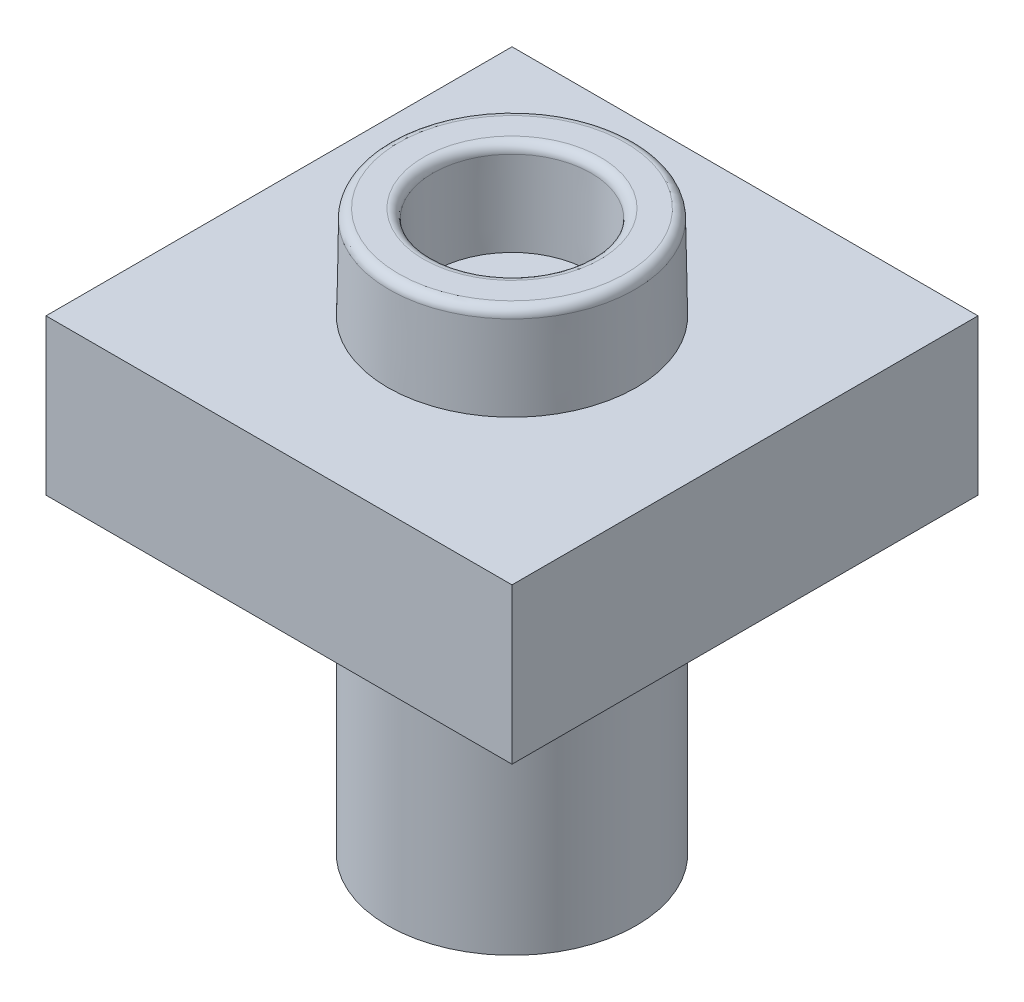
ISO-10303-21;
HEADER;
FILE_DESCRIPTION(('STEP AP214'),'2;1');
FILE_NAME('part.step','',(''),(''),'','','');
FILE_SCHEMA(('AUTOMOTIVE_DESIGN { 1 0 10303 214 1 1 1 1 }'));
ENDSEC;
DATA;
#1=APPLICATION_CONTEXT('core data for automotive mechanical design processes');
#2=APPLICATION_PROTOCOL_DEFINITION('international standard','automotive_design',2000,#1);
#3=PRODUCT_CONTEXT('',#1,'mechanical');
#4=PRODUCT('Part','Part','',(#3));
#5=PRODUCT_RELATED_PRODUCT_CATEGORY('part','',(#4));
#6=PRODUCT_DEFINITION_FORMATION('','',#4);
#7=PRODUCT_DEFINITION_CONTEXT('part definition',#1,'design');
#8=PRODUCT_DEFINITION('design','',#6,#7);
#9=PRODUCT_DEFINITION_SHAPE('','',#8);
#10=(LENGTH_UNIT() NAMED_UNIT(*) SI_UNIT(.MILLI.,.METRE.));
#11=(NAMED_UNIT(*) PLANE_ANGLE_UNIT() SI_UNIT($,.RADIAN.));
#12=(NAMED_UNIT(*) SI_UNIT($,.STERADIAN.) SOLID_ANGLE_UNIT());
#13=UNCERTAINTY_MEASURE_WITH_UNIT(LENGTH_MEASURE(1.E-05),#10,'distance_accuracy_value','');
#14=(GEOMETRIC_REPRESENTATION_CONTEXT(3) GLOBAL_UNCERTAINTY_ASSIGNED_CONTEXT((#13)) GLOBAL_UNIT_ASSIGNED_CONTEXT((#10,
#11,#12)) REPRESENTATION_CONTEXT('',''));
#15=CARTESIAN_POINT('',(0.,0.,0.));
#16=DIRECTION('',(0.,0.,1.));
#17=DIRECTION('',(1.,0.,0.));
#18=AXIS2_PLACEMENT_3D('',#15,#16,#17);
#19=CARTESIAN_POINT('',(-7.49999999999999,5.,7.5));
#20=DIRECTION('',(1.,0.,0.));
#21=DIRECTION('',(0.,0.,-1.));
#22=AXIS2_PLACEMENT_3D('',#19,#20,#21);
#23=PLANE('',#22);
#24=DIRECTION('',(0.,0.,1.));
#25=VECTOR('',#24,1.);
#26=CARTESIAN_POINT('',(-7.49999999999999,0.,7.5));
#27=LINE('',#26,#25);
#28=CARTESIAN_POINT('',(-7.49999999999999,0.,-7.5));
#29=VERTEX_POINT('',#28);
#30=CARTESIAN_POINT('',(-7.49999999999999,0.,7.5));
#31=VERTEX_POINT('',#30);
#32=EDGE_CURVE('E106',#29,#31,#27,.T.);
#33=ORIENTED_EDGE('',*,*,#32,.T.);
#34=DIRECTION('',(0.,-1.,0.));
#35=VECTOR('',#34,1.);
#36=CARTESIAN_POINT('',(-7.49999999999999,5.,7.5));
#37=LINE('',#36,#35);
#38=CARTESIAN_POINT('',(-7.49999999999999,5.,7.5));
#39=VERTEX_POINT('',#38);
#40=EDGE_CURVE('E97',#39,#31,#37,.T.);
#41=ORIENTED_EDGE('',*,*,#40,.F.);
#42=DIRECTION('',(0.,0.,1.));
#43=VECTOR('',#42,1.);
#44=CARTESIAN_POINT('',(-7.49999999999999,5.,7.5));
#45=LINE('',#44,#43);
#46=CARTESIAN_POINT('',(-7.49999999999999,5.,-7.5));
#47=VERTEX_POINT('',#46);
#48=EDGE_CURVE('E91',#47,#39,#45,.T.);
#49=ORIENTED_EDGE('',*,*,#48,.F.);
#50=DIRECTION('',(0.,-1.,0.));
#51=VECTOR('',#50,1.);
#52=CARTESIAN_POINT('',(-7.49999999999999,5.,-7.5));
#53=LINE('',#52,#51);
#54=EDGE_CURVE('E102',#47,#29,#53,.T.);
#55=ORIENTED_EDGE('',*,*,#54,.T.);
#56=EDGE_LOOP('',(#33,#41,#49,#55));
#57=FACE_BOUND('',#56,.T.);
#58=ADVANCED_FACE('F37',(#57),#23,.F.);
#59=CARTESIAN_POINT('',(7.50000000000001,5.,7.5));
#60=DIRECTION('',(0.,0.,-1.));
#61=DIRECTION('',(-1.,0.,0.));
#62=AXIS2_PLACEMENT_3D('',#59,#60,#61);
#63=PLANE('',#62);
#64=DIRECTION('',(1.,0.,0.));
#65=VECTOR('',#64,1.);
#66=CARTESIAN_POINT('',(7.50000000000001,0.,7.5));
#67=LINE('',#66,#65);
#68=CARTESIAN_POINT('',(7.50000000000001,0.,7.5));
#69=VERTEX_POINT('',#68);
#70=EDGE_CURVE('E96',#31,#69,#67,.T.);
#71=ORIENTED_EDGE('',*,*,#70,.T.);
#72=DIRECTION('',(0.,-1.,0.));
#73=VECTOR('',#72,1.);
#74=CARTESIAN_POINT('',(7.50000000000001,5.,7.5));
#75=LINE('',#74,#73);
#76=CARTESIAN_POINT('',(7.50000000000001,5.,7.5));
#77=VERTEX_POINT('',#76);
#78=EDGE_CURVE('E94',#77,#69,#75,.T.);
#79=ORIENTED_EDGE('',*,*,#78,.F.);
#80=DIRECTION('',(1.,0.,0.));
#81=VECTOR('',#80,1.);
#82=CARTESIAN_POINT('',(7.50000000000001,5.,7.5));
#83=LINE('',#82,#81);
#84=EDGE_CURVE('E86',#39,#77,#83,.T.);
#85=ORIENTED_EDGE('',*,*,#84,.F.);
#86=ORIENTED_EDGE('',*,*,#40,.T.);
#87=EDGE_LOOP('',(#71,#79,#85,#86));
#88=FACE_BOUND('',#87,.T.);
#89=ADVANCED_FACE('F95',(#88),#63,.F.);
#90=CARTESIAN_POINT('',(7.50000000000001,5.,7.5));
#91=DIRECTION('',(-1.,0.,0.));
#92=DIRECTION('',(0.,0.,1.));
#93=AXIS2_PLACEMENT_3D('',#90,#91,#92);
#94=PLANE('',#93);
#95=DIRECTION('',(0.,0.,-1.));
#96=VECTOR('',#95,1.);
#97=CARTESIAN_POINT('',(7.50000000000001,0.,7.5));
#98=LINE('',#97,#96);
#99=CARTESIAN_POINT('',(7.50000000000001,0.,-7.5));
#100=VERTEX_POINT('',#99);
#101=EDGE_CURVE('E72',#69,#100,#98,.T.);
#102=ORIENTED_EDGE('',*,*,#101,.T.);
#103=DIRECTION('',(0.,-1.,0.));
#104=VECTOR('',#103,1.);
#105=CARTESIAN_POINT('',(7.50000000000001,5.,-7.5));
#106=LINE('',#105,#104);
#107=CARTESIAN_POINT('',(7.50000000000001,5.,-7.5));
#108=VERTEX_POINT('',#107);
#109=EDGE_CURVE('E98',#108,#100,#106,.T.);
#110=ORIENTED_EDGE('',*,*,#109,.F.);
#111=DIRECTION('',(0.,0.,-1.));
#112=VECTOR('',#111,1.);
#113=CARTESIAN_POINT('',(7.50000000000001,5.,7.5));
#114=LINE('',#113,#112);
#115=EDGE_CURVE('E89',#77,#108,#114,.T.);
#116=ORIENTED_EDGE('',*,*,#115,.F.);
#117=ORIENTED_EDGE('',*,*,#78,.T.);
#118=EDGE_LOOP('',(#102,#110,#116,#117));
#119=FACE_BOUND('',#118,.T.);
#120=ADVANCED_FACE('F100',(#119),#94,.F.);
#121=CARTESIAN_POINT('',(7.50000000000001,5.,-7.5));
#122=DIRECTION('',(0.,0.,1.));
#123=DIRECTION('',(1.,0.,0.));
#124=AXIS2_PLACEMENT_3D('',#121,#122,#123);
#125=PLANE('',#124);
#126=DIRECTION('',(-1.,0.,0.));
#127=VECTOR('',#126,1.);
#128=CARTESIAN_POINT('',(7.50000000000001,0.,-7.5));
#129=LINE('',#128,#127);
#130=EDGE_CURVE('E78',#100,#29,#129,.T.);
#131=ORIENTED_EDGE('',*,*,#130,.T.);
#132=ORIENTED_EDGE('',*,*,#54,.F.);
#133=DIRECTION('',(-1.,0.,0.));
#134=VECTOR('',#133,1.);
#135=CARTESIAN_POINT('',(7.50000000000001,5.,-7.5));
#136=LINE('',#135,#134);
#137=EDGE_CURVE('E55',#108,#47,#136,.T.);
#138=ORIENTED_EDGE('',*,*,#137,.F.);
#139=ORIENTED_EDGE('',*,*,#109,.T.);
#140=EDGE_LOOP('',(#131,#132,#138,#139));
#141=FACE_BOUND('',#140,.T.);
#142=ADVANCED_FACE('F179',(#141),#125,.F.);
#143=CARTESIAN_POINT('',(0.,5.,0.));
#144=DIRECTION('',(0.,1.,0.));
#145=DIRECTION('',(0.,0.,1.));
#146=AXIS2_PLACEMENT_3D('',#143,#144,#145);
#147=PLANE('',#146);
#148=CARTESIAN_POINT('',(0.,5.,0.));
#149=DIRECTION('',(0.,1.,0.));
#150=DIRECTION('',(0.,0.,1.));
#151=AXIS2_PLACEMENT_3D('',#148,#149,#150);
#152=CIRCLE('',#151,4.);
#153=CARTESIAN_POINT('',(0.,5.,4.));
#154=VERTEX_POINT('',#153);
#155=EDGE_CURVE('E109',#154,#154,#152,.T.);
#156=ORIENTED_EDGE('',*,*,#155,.F.);
#157=EDGE_LOOP('',(#156));
#158=FACE_BOUND('',#157,.T.);
#159=ORIENTED_EDGE('',*,*,#48,.T.);
#160=ORIENTED_EDGE('',*,*,#84,.T.);
#161=ORIENTED_EDGE('',*,*,#115,.T.);
#162=ORIENTED_EDGE('',*,*,#137,.T.);
#163=EDGE_LOOP('',(#159,#160,#161,#162));
#164=FACE_BOUND('',#163,.T.);
#165=ADVANCED_FACE('F87',(#158,#164),#147,.T.);
#166=CARTESIAN_POINT('',(0.,0.,0.));
#167=DIRECTION('',(0.,1.,0.));
#168=DIRECTION('',(0.,0.,1.));
#169=AXIS2_PLACEMENT_3D('',#166,#167,#168);
#170=PLANE('',#169);
#171=CARTESIAN_POINT('',(0.,0.,0.));
#172=DIRECTION('',(0.,-1.,0.));
#173=DIRECTION('',(0.,0.,-1.));
#174=AXIS2_PLACEMENT_3D('',#171,#172,#173);
#175=CIRCLE('',#174,4.);
#176=CARTESIAN_POINT('',(0.,0.,-4.));
#177=VERTEX_POINT('',#176);
#178=EDGE_CURVE('E11',#177,#177,#175,.T.);
#179=ORIENTED_EDGE('',*,*,#178,.F.);
#180=EDGE_LOOP('',(#179));
#181=FACE_BOUND('',#180,.T.);
#182=ORIENTED_EDGE('',*,*,#32,.F.);
#183=ORIENTED_EDGE('',*,*,#130,.F.);
#184=ORIENTED_EDGE('',*,*,#101,.F.);
#185=ORIENTED_EDGE('',*,*,#70,.F.);
#186=EDGE_LOOP('',(#182,#183,#184,#185));
#187=FACE_BOUND('',#186,.T.);
#188=ADVANCED_FACE('F142',(#181,#187),#170,.F.);
#189=CARTESIAN_POINT('',(0.,8.,0.));
#190=DIRECTION('',(0.,1.,0.));
#191=DIRECTION('',(0.,0.,1.));
#192=AXIS2_PLACEMENT_3D('',#189,#190,#191);
#193=PLANE('',#192);
#194=CARTESIAN_POINT('',(0.,8.,0.));
#195=DIRECTION('',(0.,1.,0.));
#196=DIRECTION('',(0.,0.,1.));
#197=AXIS2_PLACEMENT_3D('',#194,#195,#196);
#198=CIRCLE('',#197,2.84717437371936);
#199=CARTESIAN_POINT('',(0.,8.,2.84717437371936));
#200=VERTEX_POINT('',#199);
#201=EDGE_CURVE('E124',#200,#200,#198,.F.);
#202=ORIENTED_EDGE('',*,*,#201,.T.);
#203=EDGE_LOOP('',(#202));
#204=FACE_BOUND('',#203,.T.);
#205=CARTESIAN_POINT('',(0.,8.,0.));
#206=DIRECTION('',(0.,1.,0.));
#207=DIRECTION('',(0.,0.,1.));
#208=AXIS2_PLACEMENT_3D('',#205,#206,#207);
#209=CIRCLE('',#208,3.65282562628064);
#210=CARTESIAN_POINT('',(0.,8.,3.65282562628064));
#211=VERTEX_POINT('',#210);
#212=EDGE_CURVE('E122',#211,#211,#209,.T.);
#213=ORIENTED_EDGE('',*,*,#212,.T.);
#214=EDGE_LOOP('',(#213));
#215=FACE_BOUND('',#214,.T.);
#216=ADVANCED_FACE('F140',(#204,#215),#193,.T.);
#217=CARTESIAN_POINT('',(0.,5.,0.));
#218=DIRECTION('',(0.,-1.,0.));
#219=DIRECTION('',(0.,0.,1.));
#220=AXIS2_PLACEMENT_3D('',#217,#218,#219);
#221=CONICAL_SURFACE('',#220,4.,0.0174532925199433);
#222=CARTESIAN_POINT('',(0.,7.70523572193119,0.));
#223=DIRECTION('',(0.,-1.,0.));
#224=DIRECTION('',(0.,0.,-1.));
#225=AXIS2_PLACEMENT_3D('',#222,#223,#224);
#226=CIRCLE('',#225,3.95277993482756);
#227=CARTESIAN_POINT('',(0.,7.70523572193119,-3.95277993482756));
#228=VERTEX_POINT('',#227);
#229=EDGE_CURVE('E41',#228,#228,#226,.T.);
#230=ORIENTED_EDGE('',*,*,#229,.T.);
#231=EDGE_LOOP('',(#230));
#232=FACE_BOUND('',#231,.T.);
#233=ORIENTED_EDGE('',*,*,#155,.T.);
#234=EDGE_LOOP('',(#233));
#235=FACE_BOUND('',#234,.T.);
#236=ADVANCED_FACE('F131',(#232,#235),#221,.T.);
#237=CARTESIAN_POINT('',(0.,5.,0.));
#238=DIRECTION('',(0.,1.,0.));
#239=DIRECTION('',(0.,0.,1.));
#240=AXIS2_PLACEMENT_3D('',#237,#238,#239);
#241=CONICAL_SURFACE('',#240,2.5,0.0174532925199433);
#242=CARTESIAN_POINT('',(0.,7.70523572193119,0.));
#243=DIRECTION('',(0.,-1.,0.));
#244=DIRECTION('',(0.,0.,-1.));
#245=AXIS2_PLACEMENT_3D('',#242,#243,#244);
#246=CIRCLE('',#245,2.54722006517244);
#247=CARTESIAN_POINT('',(0.,7.70523572193119,-2.54722006517244));
#248=VERTEX_POINT('',#247);
#249=EDGE_CURVE('E119',#248,#248,#246,.F.);
#250=ORIENTED_EDGE('',*,*,#249,.T.);
#251=EDGE_LOOP('',(#250));
#252=FACE_BOUND('',#251,.T.);
#253=CARTESIAN_POINT('',(0.,5.,0.));
#254=DIRECTION('',(0.,1.,0.));
#255=DIRECTION('',(0.,0.,1.));
#256=AXIS2_PLACEMENT_3D('',#253,#254,#255);
#257=CIRCLE('',#256,2.5);
#258=CARTESIAN_POINT('',(0.,5.,2.5));
#259=VERTEX_POINT('',#258);
#260=EDGE_CURVE('E116',#259,#259,#257,.F.);
#261=ORIENTED_EDGE('',*,*,#260,.T.);
#262=EDGE_LOOP('',(#261));
#263=FACE_BOUND('',#262,.T.);
#264=ADVANCED_FACE('F148',(#252,#263),#241,.F.);
#265=ORIENTED_EDGE('',*,*,#260,.F.);
#266=EDGE_LOOP('',(#265));
#267=FACE_BOUND('',#266,.T.);
#268=ADVANCED_FACE('F162',(#267),#147,.T.);
#269=CARTESIAN_POINT('',(0.,7.7,0.));
#270=DIRECTION('',(0.,1.,0.));
#271=DIRECTION('',(0.,0.,1.));
#272=AXIS2_PLACEMENT_3D('',#269,#270,#271);
#273=TOROIDAL_SURFACE('',#272,2.84717437371936,0.3);
#274=ORIENTED_EDGE('',*,*,#201,.F.);
#275=EDGE_LOOP('',(#274));
#276=FACE_BOUND('',#275,.T.);
#277=ORIENTED_EDGE('',*,*,#249,.F.);
#278=EDGE_LOOP('',(#277));
#279=FACE_BOUND('',#278,.T.);
#280=ADVANCED_FACE('F137',(#276,#279),#273,.T.);
#281=CARTESIAN_POINT('',(0.,7.7,0.));
#282=DIRECTION('',(0.,1.,0.));
#283=DIRECTION('',(0.,0.,1.));
#284=AXIS2_PLACEMENT_3D('',#281,#282,#283);
#285=TOROIDAL_SURFACE('',#284,3.65282562628064,0.3);
#286=ORIENTED_EDGE('',*,*,#229,.F.);
#287=EDGE_LOOP('',(#286));
#288=FACE_BOUND('',#287,.T.);
#289=ORIENTED_EDGE('',*,*,#212,.F.);
#290=EDGE_LOOP('',(#289));
#291=FACE_BOUND('',#290,.T.);
#292=ADVANCED_FACE('F39',(#288,#291),#285,.T.);
#293=CARTESIAN_POINT('',(0.,-10.,0.));
#294=DIRECTION('',(0.,1.,0.));
#295=DIRECTION('',(0.,0.,1.));
#296=AXIS2_PLACEMENT_3D('',#293,#294,#295);
#297=CYLINDRICAL_SURFACE('',#296,4.);
#298=CARTESIAN_POINT('',(0.,-10.,0.));
#299=DIRECTION('',(0.,-1.,0.));
#300=DIRECTION('',(0.,0.,-1.));
#301=AXIS2_PLACEMENT_3D('',#298,#299,#300);
#302=CIRCLE('',#301,4.);
#303=CARTESIAN_POINT('',(0.,-10.,-4.));
#304=VERTEX_POINT('',#303);
#305=EDGE_CURVE('E295',#304,#304,#302,.T.);
#306=ORIENTED_EDGE('',*,*,#305,.F.);
#307=EDGE_LOOP('',(#306));
#308=FACE_BOUND('',#307,.T.);
#309=ORIENTED_EDGE('',*,*,#178,.T.);
#310=EDGE_LOOP('',(#309));
#311=FACE_BOUND('',#310,.T.);
#312=ADVANCED_FACE('F136',(#308,#311),#297,.T.);
#313=CARTESIAN_POINT('',(0.,-10.,0.));
#314=DIRECTION('',(0.,-1.,0.));
#315=DIRECTION('',(0.,0.,-1.));
#316=AXIS2_PLACEMENT_3D('',#313,#314,#315);
#317=PLANE('',#316);
#318=ORIENTED_EDGE('',*,*,#305,.T.);
#319=EDGE_LOOP('',(#318));
#320=FACE_BOUND('',#319,.T.);
#321=ADVANCED_FACE('F215',(#320),#317,.T.);
#322=CLOSED_SHELL('',(#58,#89,#120,#142,#165,#188,#216,#236,#264,#268,#280,#292,#312,#321));
#323=MANIFOLD_SOLID_BREP('B2',#322);
#324=ADVANCED_BREP_SHAPE_REPRESENTATION('',(#18,#323),#14);
#325=SHAPE_DEFINITION_REPRESENTATION(#9,#324);
ENDSEC;
END-ISO-10303-21;
